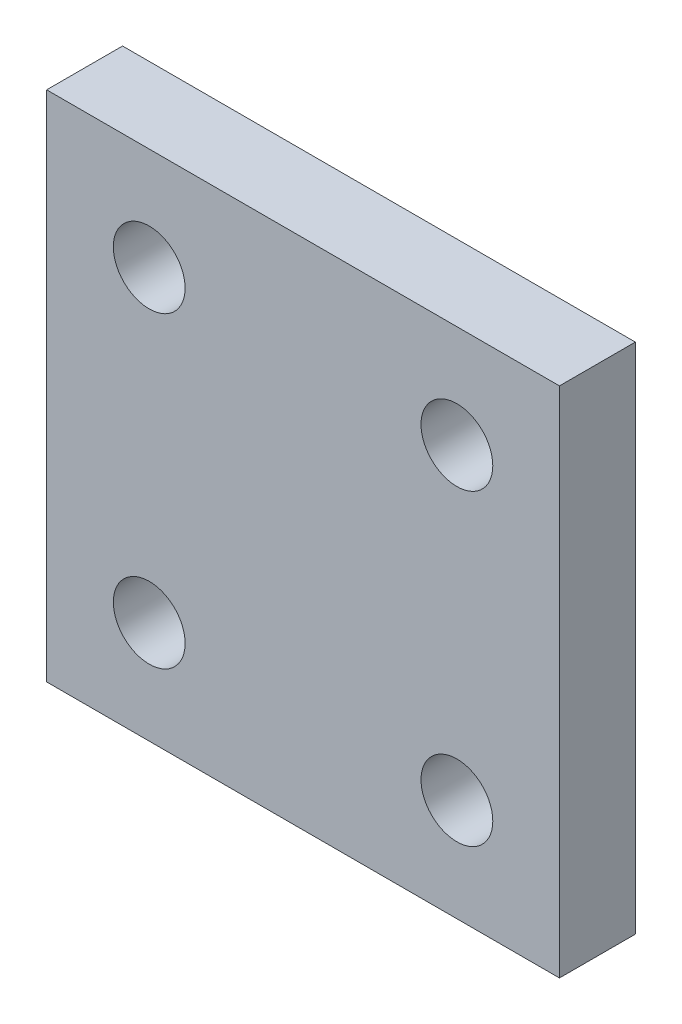
ISO-10303-21;
HEADER;
FILE_DESCRIPTION(('STEP AP214'),'2;1');
FILE_NAME('part.step','',(''),(''),'','','');
FILE_SCHEMA(('AUTOMOTIVE_DESIGN { 1 0 10303 214 1 1 1 1 }'));
ENDSEC;
DATA;
#1=APPLICATION_CONTEXT('core data for automotive mechanical design processes');
#2=APPLICATION_PROTOCOL_DEFINITION('international standard','automotive_design',2000,#1);
#3=PRODUCT_CONTEXT('',#1,'mechanical');
#4=PRODUCT('Part','Part','',(#3));
#5=PRODUCT_RELATED_PRODUCT_CATEGORY('part','',(#4));
#6=PRODUCT_DEFINITION_FORMATION('','',#4);
#7=PRODUCT_DEFINITION_CONTEXT('part definition',#1,'design');
#8=PRODUCT_DEFINITION('design','',#6,#7);
#9=PRODUCT_DEFINITION_SHAPE('','',#8);
#10=(LENGTH_UNIT() NAMED_UNIT(*) SI_UNIT(.MILLI.,.METRE.));
#11=(NAMED_UNIT(*) PLANE_ANGLE_UNIT() SI_UNIT($,.RADIAN.));
#12=(NAMED_UNIT(*) SI_UNIT($,.STERADIAN.) SOLID_ANGLE_UNIT());
#13=UNCERTAINTY_MEASURE_WITH_UNIT(LENGTH_MEASURE(1.E-05),#10,'distance_accuracy_value','');
#14=(GEOMETRIC_REPRESENTATION_CONTEXT(3) GLOBAL_UNCERTAINTY_ASSIGNED_CONTEXT((#13)) GLOBAL_UNIT_ASSIGNED_CONTEXT((#10,
#11,#12)) REPRESENTATION_CONTEXT('',''));
#15=CARTESIAN_POINT('',(0.,0.,0.));
#16=DIRECTION('',(0.,0.,1.));
#17=DIRECTION('',(1.,0.,0.));
#18=AXIS2_PLACEMENT_3D('',#15,#16,#17);
#19=CARTESIAN_POINT('',(0.,0.,3.7));
#20=DIRECTION('',(1.,0.,0.));
#21=DIRECTION('',(0.,0.,-1.));
#22=AXIS2_PLACEMENT_3D('',#19,#20,#21);
#23=PLANE('',#22);
#24=DIRECTION('',(0.,-1.,0.));
#25=VECTOR('',#24,1.);
#26=CARTESIAN_POINT('',(0.,0.,0.));
#27=LINE('',#26,#25);
#28=CARTESIAN_POINT('',(0.,25.,0.));
#29=VERTEX_POINT('',#28);
#30=CARTESIAN_POINT('',(0.,0.,0.));
#31=VERTEX_POINT('',#30);
#32=EDGE_CURVE('E98',#29,#31,#27,.T.);
#33=ORIENTED_EDGE('',*,*,#32,.T.);
#34=DIRECTION('',(0.,0.,-1.));
#35=VECTOR('',#34,1.);
#36=CARTESIAN_POINT('',(0.,0.,3.7));
#37=LINE('',#36,#35);
#38=CARTESIAN_POINT('',(0.,0.,3.7));
#39=VERTEX_POINT('',#38);
#40=EDGE_CURVE('E11',#39,#31,#37,.T.);
#41=ORIENTED_EDGE('',*,*,#40,.F.);
#42=DIRECTION('',(0.,-1.,0.));
#43=VECTOR('',#42,1.);
#44=CARTESIAN_POINT('',(0.,0.,3.7));
#45=LINE('',#44,#43);
#46=CARTESIAN_POINT('',(0.,25.,3.7));
#47=VERTEX_POINT('',#46);
#48=EDGE_CURVE('E86',#47,#39,#45,.T.);
#49=ORIENTED_EDGE('',*,*,#48,.F.);
#50=DIRECTION('',(0.,0.,-1.));
#51=VECTOR('',#50,1.);
#52=CARTESIAN_POINT('',(0.,25.,3.7));
#53=LINE('',#52,#51);
#54=EDGE_CURVE('E94',#47,#29,#53,.T.);
#55=ORIENTED_EDGE('',*,*,#54,.T.);
#56=EDGE_LOOP('',(#33,#41,#49,#55));
#57=FACE_BOUND('',#56,.T.);
#58=ADVANCED_FACE('F35',(#57),#23,.F.);
#59=CARTESIAN_POINT('',(0.,0.,3.7));
#60=DIRECTION('',(0.,1.,0.));
#61=DIRECTION('',(0.,0.,1.));
#62=AXIS2_PLACEMENT_3D('',#59,#60,#61);
#63=PLANE('',#62);
#64=DIRECTION('',(1.,0.,0.));
#65=VECTOR('',#64,1.);
#66=CARTESIAN_POINT('',(0.,0.,0.));
#67=LINE('',#66,#65);
#68=CARTESIAN_POINT('',(25.,0.,0.));
#69=VERTEX_POINT('',#68);
#70=EDGE_CURVE('E90',#31,#69,#67,.T.);
#71=ORIENTED_EDGE('',*,*,#70,.T.);
#72=DIRECTION('',(0.,0.,-1.));
#73=VECTOR('',#72,1.);
#74=CARTESIAN_POINT('',(25.,0.,3.7));
#75=LINE('',#74,#73);
#76=CARTESIAN_POINT('',(25.,0.,3.7));
#77=VERTEX_POINT('',#76);
#78=EDGE_CURVE('E43',#77,#69,#75,.T.);
#79=ORIENTED_EDGE('',*,*,#78,.F.);
#80=DIRECTION('',(1.,0.,0.));
#81=VECTOR('',#80,1.);
#82=CARTESIAN_POINT('',(0.,0.,3.7));
#83=LINE('',#82,#81);
#84=EDGE_CURVE('E81',#39,#77,#83,.T.);
#85=ORIENTED_EDGE('',*,*,#84,.F.);
#86=ORIENTED_EDGE('',*,*,#40,.T.);
#87=EDGE_LOOP('',(#71,#79,#85,#86));
#88=FACE_BOUND('',#87,.T.);
#89=ADVANCED_FACE('F89',(#88),#63,.F.);
#90=CARTESIAN_POINT('',(25.,0.,3.7));
#91=DIRECTION('',(-1.,0.,0.));
#92=DIRECTION('',(0.,0.,1.));
#93=AXIS2_PLACEMENT_3D('',#90,#91,#92);
#94=PLANE('',#93);
#95=DIRECTION('',(0.,1.,0.));
#96=VECTOR('',#95,1.);
#97=CARTESIAN_POINT('',(25.,0.,0.));
#98=LINE('',#97,#96);
#99=CARTESIAN_POINT('',(25.,25.,0.));
#100=VERTEX_POINT('',#99);
#101=EDGE_CURVE('E68',#69,#100,#98,.T.);
#102=ORIENTED_EDGE('',*,*,#101,.T.);
#103=DIRECTION('',(0.,0.,-1.));
#104=VECTOR('',#103,1.);
#105=CARTESIAN_POINT('',(25.,25.,3.7));
#106=LINE('',#105,#104);
#107=CARTESIAN_POINT('',(25.,25.,3.7));
#108=VERTEX_POINT('',#107);
#109=EDGE_CURVE('E91',#108,#100,#106,.T.);
#110=ORIENTED_EDGE('',*,*,#109,.F.);
#111=DIRECTION('',(0.,1.,0.));
#112=VECTOR('',#111,1.);
#113=CARTESIAN_POINT('',(25.,0.,3.7));
#114=LINE('',#113,#112);
#115=EDGE_CURVE('E84',#77,#108,#114,.T.);
#116=ORIENTED_EDGE('',*,*,#115,.F.);
#117=ORIENTED_EDGE('',*,*,#78,.T.);
#118=EDGE_LOOP('',(#102,#110,#116,#117));
#119=FACE_BOUND('',#118,.T.);
#120=ADVANCED_FACE('F92',(#119),#94,.F.);
#121=CARTESIAN_POINT('',(0.,25.,3.7));
#122=DIRECTION('',(0.,-1.,0.));
#123=DIRECTION('',(0.,0.,-1.));
#124=AXIS2_PLACEMENT_3D('',#121,#122,#123);
#125=PLANE('',#124);
#126=DIRECTION('',(-1.,0.,0.));
#127=VECTOR('',#126,1.);
#128=CARTESIAN_POINT('',(0.,25.,0.));
#129=LINE('',#128,#127);
#130=EDGE_CURVE('E74',#100,#29,#129,.T.);
#131=ORIENTED_EDGE('',*,*,#130,.T.);
#132=ORIENTED_EDGE('',*,*,#54,.F.);
#133=DIRECTION('',(-1.,0.,0.));
#134=VECTOR('',#133,1.);
#135=CARTESIAN_POINT('',(0.,25.,3.7));
#136=LINE('',#135,#134);
#137=EDGE_CURVE('E51',#108,#47,#136,.T.);
#138=ORIENTED_EDGE('',*,*,#137,.F.);
#139=ORIENTED_EDGE('',*,*,#109,.T.);
#140=EDGE_LOOP('',(#131,#132,#138,#139));
#141=FACE_BOUND('',#140,.T.);
#142=ADVANCED_FACE('F106',(#141),#125,.F.);
#143=CARTESIAN_POINT('',(0.,0.,3.7));
#144=DIRECTION('',(0.,0.,-1.));
#145=DIRECTION('',(-1.,0.,0.));
#146=AXIS2_PLACEMENT_3D('',#143,#144,#145);
#147=PLANE('',#146);
#148=CARTESIAN_POINT('',(20.,5.,3.7));
#149=DIRECTION('',(0.,0.,1.));
#150=DIRECTION('',(1.,0.,0.));
#151=AXIS2_PLACEMENT_3D('',#148,#149,#150);
#152=CIRCLE('',#151,1.75);
#153=CARTESIAN_POINT('',(21.75,5.,3.7));
#154=VERTEX_POINT('',#153);
#155=EDGE_CURVE('E118',#154,#154,#152,.T.);
#156=ORIENTED_EDGE('',*,*,#155,.F.);
#157=EDGE_LOOP('',(#156));
#158=FACE_BOUND('',#157,.T.);
#159=CARTESIAN_POINT('',(5.,5.,3.7));
#160=DIRECTION('',(0.,0.,1.));
#161=DIRECTION('',(1.,0.,0.));
#162=AXIS2_PLACEMENT_3D('',#159,#160,#161);
#163=CIRCLE('',#162,1.75);
#164=CARTESIAN_POINT('',(6.75,5.,3.7));
#165=VERTEX_POINT('',#164);
#166=EDGE_CURVE('E124',#165,#165,#163,.T.);
#167=ORIENTED_EDGE('',*,*,#166,.F.);
#168=EDGE_LOOP('',(#167));
#169=FACE_BOUND('',#168,.T.);
#170=CARTESIAN_POINT('',(5.,20.,3.7));
#171=DIRECTION('',(0.,0.,1.));
#172=DIRECTION('',(1.,0.,0.));
#173=AXIS2_PLACEMENT_3D('',#170,#171,#172);
#174=CIRCLE('',#173,1.75);
#175=CARTESIAN_POINT('',(6.75,20.,3.7));
#176=VERTEX_POINT('',#175);
#177=EDGE_CURVE('E130',#176,#176,#174,.T.);
#178=ORIENTED_EDGE('',*,*,#177,.F.);
#179=EDGE_LOOP('',(#178));
#180=FACE_BOUND('',#179,.T.);
#181=CARTESIAN_POINT('',(20.,20.,3.7));
#182=DIRECTION('',(0.,0.,1.));
#183=DIRECTION('',(1.,0.,0.));
#184=AXIS2_PLACEMENT_3D('',#181,#182,#183);
#185=CIRCLE('',#184,1.75);
#186=CARTESIAN_POINT('',(21.75,20.,3.7));
#187=VERTEX_POINT('',#186);
#188=EDGE_CURVE('E112',#187,#187,#185,.T.);
#189=ORIENTED_EDGE('',*,*,#188,.F.);
#190=EDGE_LOOP('',(#189));
#191=FACE_BOUND('',#190,.T.);
#192=ORIENTED_EDGE('',*,*,#48,.T.);
#193=ORIENTED_EDGE('',*,*,#84,.T.);
#194=ORIENTED_EDGE('',*,*,#115,.T.);
#195=ORIENTED_EDGE('',*,*,#137,.T.);
#196=EDGE_LOOP('',(#192,#193,#194,#195));
#197=FACE_BOUND('',#196,.T.);
#198=ADVANCED_FACE('F82',(#158,#169,#180,#191,#197),#147,.F.);
#199=CARTESIAN_POINT('',(0.,0.,0.));
#200=DIRECTION('',(0.,0.,-1.));
#201=DIRECTION('',(-1.,0.,0.));
#202=AXIS2_PLACEMENT_3D('',#199,#200,#201);
#203=PLANE('',#202);
#204=CARTESIAN_POINT('',(20.,5.,0.));
#205=DIRECTION('',(0.,0.,1.));
#206=DIRECTION('',(1.,0.,0.));
#207=AXIS2_PLACEMENT_3D('',#204,#205,#206);
#208=CIRCLE('',#207,1.75);
#209=CARTESIAN_POINT('',(21.75,5.,0.));
#210=VERTEX_POINT('',#209);
#211=EDGE_CURVE('E121',#210,#210,#208,.T.);
#212=ORIENTED_EDGE('',*,*,#211,.T.);
#213=EDGE_LOOP('',(#212));
#214=FACE_BOUND('',#213,.T.);
#215=CARTESIAN_POINT('',(5.,5.,0.));
#216=DIRECTION('',(0.,0.,1.));
#217=DIRECTION('',(1.,0.,0.));
#218=AXIS2_PLACEMENT_3D('',#215,#216,#217);
#219=CIRCLE('',#218,1.75);
#220=CARTESIAN_POINT('',(6.75,5.,0.));
#221=VERTEX_POINT('',#220);
#222=EDGE_CURVE('E127',#221,#221,#219,.T.);
#223=ORIENTED_EDGE('',*,*,#222,.T.);
#224=EDGE_LOOP('',(#223));
#225=FACE_BOUND('',#224,.T.);
#226=CARTESIAN_POINT('',(5.,20.,0.));
#227=DIRECTION('',(0.,0.,1.));
#228=DIRECTION('',(1.,0.,0.));
#229=AXIS2_PLACEMENT_3D('',#226,#227,#228);
#230=CIRCLE('',#229,1.75);
#231=CARTESIAN_POINT('',(6.75,20.,0.));
#232=VERTEX_POINT('',#231);
#233=EDGE_CURVE('E115',#232,#232,#230,.T.);
#234=ORIENTED_EDGE('',*,*,#233,.T.);
#235=EDGE_LOOP('',(#234));
#236=FACE_BOUND('',#235,.T.);
#237=CARTESIAN_POINT('',(20.,20.,0.));
#238=DIRECTION('',(0.,0.,1.));
#239=DIRECTION('',(1.,0.,0.));
#240=AXIS2_PLACEMENT_3D('',#237,#238,#239);
#241=CIRCLE('',#240,1.75);
#242=CARTESIAN_POINT('',(21.75,20.,0.));
#243=VERTEX_POINT('',#242);
#244=EDGE_CURVE('E101',#243,#243,#241,.T.);
#245=ORIENTED_EDGE('',*,*,#244,.T.);
#246=EDGE_LOOP('',(#245));
#247=FACE_BOUND('',#246,.T.);
#248=ORIENTED_EDGE('',*,*,#32,.F.);
#249=ORIENTED_EDGE('',*,*,#130,.F.);
#250=ORIENTED_EDGE('',*,*,#101,.F.);
#251=ORIENTED_EDGE('',*,*,#70,.F.);
#252=EDGE_LOOP('',(#248,#249,#250,#251));
#253=FACE_BOUND('',#252,.T.);
#254=ADVANCED_FACE('F109',(#214,#225,#236,#247,#253),#203,.T.);
#255=CARTESIAN_POINT('',(20.,20.,0.));
#256=DIRECTION('',(0.,0.,1.));
#257=DIRECTION('',(1.,0.,0.));
#258=AXIS2_PLACEMENT_3D('',#255,#256,#257);
#259=CYLINDRICAL_SURFACE('',#258,1.75);
#260=ORIENTED_EDGE('',*,*,#244,.F.);
#261=EDGE_LOOP('',(#260));
#262=FACE_BOUND('',#261,.T.);
#263=ORIENTED_EDGE('',*,*,#188,.T.);
#264=EDGE_LOOP('',(#263));
#265=FACE_BOUND('',#264,.T.);
#266=ADVANCED_FACE('F142',(#262,#265),#259,.F.);
#267=CARTESIAN_POINT('',(5.,20.,0.));
#268=DIRECTION('',(0.,0.,1.));
#269=DIRECTION('',(1.,0.,0.));
#270=AXIS2_PLACEMENT_3D('',#267,#268,#269);
#271=CYLINDRICAL_SURFACE('',#270,1.75);
#272=ORIENTED_EDGE('',*,*,#233,.F.);
#273=EDGE_LOOP('',(#272));
#274=FACE_BOUND('',#273,.T.);
#275=ORIENTED_EDGE('',*,*,#177,.T.);
#276=EDGE_LOOP('',(#275));
#277=FACE_BOUND('',#276,.T.);
#278=ADVANCED_FACE('F138',(#274,#277),#271,.F.);
#279=CARTESIAN_POINT('',(5.,5.,0.));
#280=DIRECTION('',(0.,0.,1.));
#281=DIRECTION('',(1.,0.,0.));
#282=AXIS2_PLACEMENT_3D('',#279,#280,#281);
#283=CYLINDRICAL_SURFACE('',#282,1.75);
#284=ORIENTED_EDGE('',*,*,#222,.F.);
#285=EDGE_LOOP('',(#284));
#286=FACE_BOUND('',#285,.T.);
#287=ORIENTED_EDGE('',*,*,#166,.T.);
#288=EDGE_LOOP('',(#287));
#289=FACE_BOUND('',#288,.T.);
#290=ADVANCED_FACE('F141',(#286,#289),#283,.F.);
#291=CARTESIAN_POINT('',(20.,5.,0.));
#292=DIRECTION('',(0.,0.,1.));
#293=DIRECTION('',(1.,0.,0.));
#294=AXIS2_PLACEMENT_3D('',#291,#292,#293);
#295=CYLINDRICAL_SURFACE('',#294,1.75);
#296=ORIENTED_EDGE('',*,*,#211,.F.);
#297=EDGE_LOOP('',(#296));
#298=FACE_BOUND('',#297,.T.);
#299=ORIENTED_EDGE('',*,*,#155,.T.);
#300=EDGE_LOOP('',(#299));
#301=FACE_BOUND('',#300,.T.);
#302=ADVANCED_FACE('F203',(#298,#301),#295,.F.);
#303=CLOSED_SHELL('',(#58,#89,#120,#142,#198,#254,#266,#278,#290,#302));
#304=MANIFOLD_SOLID_BREP('B2',#303);
#305=ADVANCED_BREP_SHAPE_REPRESENTATION('',(#18,#304),#14);
#306=SHAPE_DEFINITION_REPRESENTATION(#9,#305);
ENDSEC;
END-ISO-10303-21;
